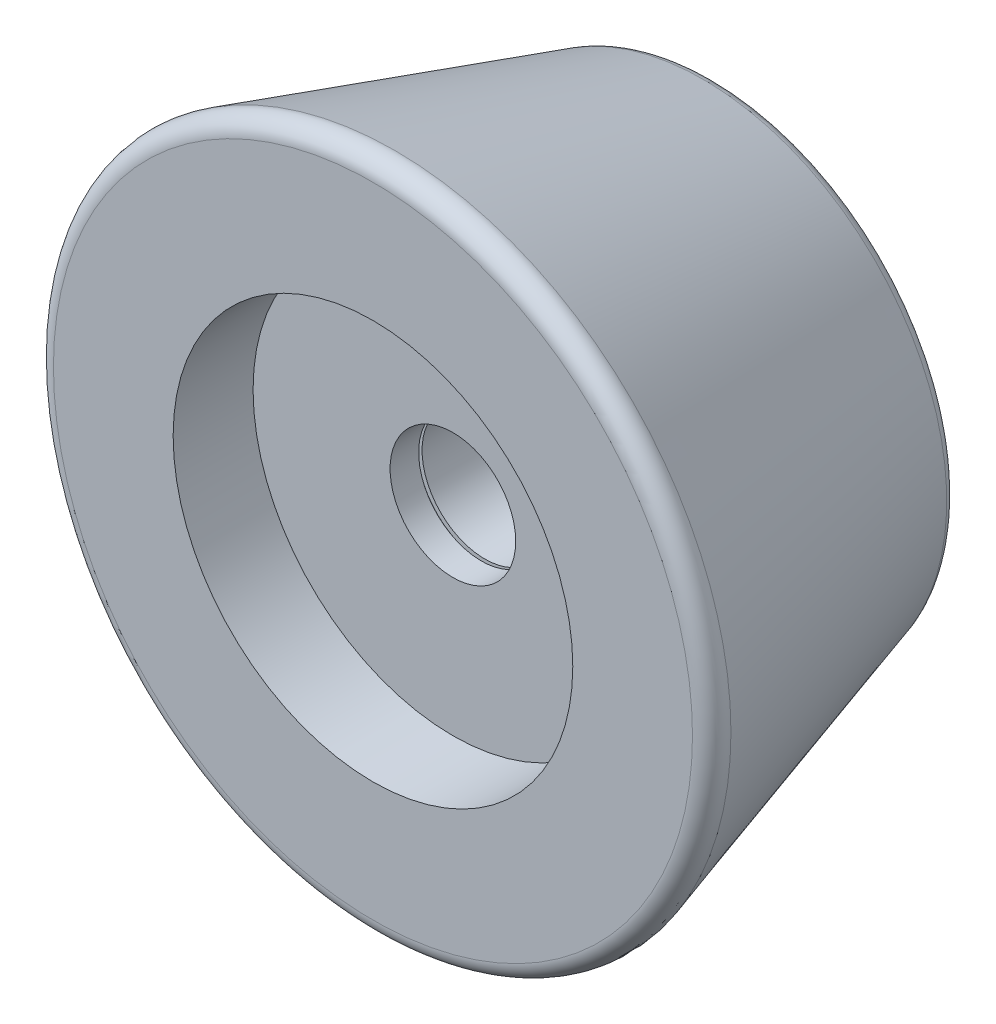
ISO-10303-21;
HEADER;
FILE_DESCRIPTION(('STEP AP214'),'2;1');
FILE_NAME('part.step','',(''),(''),'','','');
FILE_SCHEMA(('AUTOMOTIVE_DESIGN { 1 0 10303 214 1 1 1 1 }'));
ENDSEC;
DATA;
#1=APPLICATION_CONTEXT('core data for automotive mechanical design processes');
#2=APPLICATION_PROTOCOL_DEFINITION('international standard','automotive_design',2000,#1);
#3=PRODUCT_CONTEXT('',#1,'mechanical');
#4=PRODUCT('Part','Part','',(#3));
#5=PRODUCT_RELATED_PRODUCT_CATEGORY('part','',(#4));
#6=PRODUCT_DEFINITION_FORMATION('','',#4);
#7=PRODUCT_DEFINITION_CONTEXT('part definition',#1,'design');
#8=PRODUCT_DEFINITION('design','',#6,#7);
#9=PRODUCT_DEFINITION_SHAPE('','',#8);
#10=(LENGTH_UNIT() NAMED_UNIT(*) SI_UNIT(.MILLI.,.METRE.));
#11=(NAMED_UNIT(*) PLANE_ANGLE_UNIT() SI_UNIT($,.RADIAN.));
#12=(NAMED_UNIT(*) SI_UNIT($,.STERADIAN.) SOLID_ANGLE_UNIT());
#13=UNCERTAINTY_MEASURE_WITH_UNIT(LENGTH_MEASURE(1.E-05),#10,'distance_accuracy_value','');
#14=(GEOMETRIC_REPRESENTATION_CONTEXT(3) GLOBAL_UNCERTAINTY_ASSIGNED_CONTEXT((#13)) GLOBAL_UNIT_ASSIGNED_CONTEXT((#10,
#11,#12)) REPRESENTATION_CONTEXT('',''));
#15=CARTESIAN_POINT('',(0.,0.,0.));
#16=DIRECTION('',(0.,0.,1.));
#17=DIRECTION('',(1.,0.,0.));
#18=AXIS2_PLACEMENT_3D('',#15,#16,#17);
#19=CARTESIAN_POINT('',(2.75,0.,10.25));
#20=DIRECTION('',(0.,0.,-1.));
#21=DIRECTION('',(-1.,0.,0.));
#22=AXIS2_PLACEMENT_3D('',#19,#20,#21);
#23=PLANE('',#22);
#24=CARTESIAN_POINT('',(0.,0.,10.25));
#25=DIRECTION('',(0.,0.,1.));
#26=DIRECTION('',(1.,0.,0.));
#27=AXIS2_PLACEMENT_3D('',#24,#25,#26);
#28=CIRCLE('',#27,2.75);
#29=CARTESIAN_POINT('',(2.75,0.,10.25));
#30=VERTEX_POINT('',#29);
#31=EDGE_CURVE('E56',#30,#30,#28,.T.);
#32=ORIENTED_EDGE('',*,*,#31,.T.);
#33=EDGE_LOOP('',(#32));
#34=FACE_BOUND('',#33,.T.);
#35=CARTESIAN_POINT('',(0.,0.,10.25));
#36=DIRECTION('',(0.,0.,1.));
#37=DIRECTION('',(1.,0.,0.));
#38=AXIS2_PLACEMENT_3D('',#35,#36,#37);
#39=CIRCLE('',#38,2.95);
#40=CARTESIAN_POINT('',(2.95,0.,10.25));
#41=VERTEX_POINT('',#40);
#42=EDGE_CURVE('E83',#41,#41,#39,.T.);
#43=ORIENTED_EDGE('',*,*,#42,.F.);
#44=EDGE_LOOP('',(#43));
#45=FACE_BOUND('',#44,.T.);
#46=ADVANCED_FACE('F36',(#34,#45),#23,.T.);
#47=CARTESIAN_POINT('',(0.,0.,0.));
#48=DIRECTION('',(0.,0.,1.));
#49=DIRECTION('',(1.,0.,0.));
#50=AXIS2_PLACEMENT_3D('',#47,#48,#49);
#51=CYLINDRICAL_SURFACE('',#50,2.75);
#52=CARTESIAN_POINT('',(0.,0.,11.5));
#53=DIRECTION('',(0.,0.,1.));
#54=DIRECTION('',(1.,0.,0.));
#55=AXIS2_PLACEMENT_3D('',#52,#53,#54);
#56=CIRCLE('',#55,2.75);
#57=CARTESIAN_POINT('',(2.75,0.,11.5));
#58=VERTEX_POINT('',#57);
#59=EDGE_CURVE('E59',#58,#58,#56,.T.);
#60=ORIENTED_EDGE('',*,*,#59,.T.);
#61=EDGE_LOOP('',(#60));
#62=FACE_BOUND('',#61,.T.);
#63=ORIENTED_EDGE('',*,*,#31,.F.);
#64=EDGE_LOOP('',(#63));
#65=FACE_BOUND('',#64,.T.);
#66=ADVANCED_FACE('F91',(#62,#65),#51,.F.);
#67=CARTESIAN_POINT('',(2.75,0.,11.5));
#68=DIRECTION('',(0.,0.,1.));
#69=DIRECTION('',(1.,0.,0.));
#70=AXIS2_PLACEMENT_3D('',#67,#68,#69);
#71=PLANE('',#70);
#72=CARTESIAN_POINT('',(0.,0.,11.5));
#73=DIRECTION('',(0.,0.,1.));
#74=DIRECTION('',(1.,0.,0.));
#75=AXIS2_PLACEMENT_3D('',#72,#73,#74);
#76=CIRCLE('',#75,8.75);
#77=CARTESIAN_POINT('',(8.75,0.,11.5));
#78=VERTEX_POINT('',#77);
#79=EDGE_CURVE('E62',#78,#78,#76,.T.);
#80=ORIENTED_EDGE('',*,*,#79,.T.);
#81=EDGE_LOOP('',(#80));
#82=FACE_BOUND('',#81,.T.);
#83=ORIENTED_EDGE('',*,*,#59,.F.);
#84=EDGE_LOOP('',(#83));
#85=FACE_BOUND('',#84,.T.);
#86=ADVANCED_FACE('F97',(#82,#85),#71,.T.);
#87=CARTESIAN_POINT('',(0.,0.,0.));
#88=DIRECTION('',(0.,0.,1.));
#89=DIRECTION('',(1.,0.,0.));
#90=AXIS2_PLACEMENT_3D('',#87,#88,#89);
#91=CYLINDRICAL_SURFACE('',#90,8.75);
#92=CARTESIAN_POINT('',(0.,0.,15.));
#93=DIRECTION('',(0.,0.,1.));
#94=DIRECTION('',(1.,0.,0.));
#95=AXIS2_PLACEMENT_3D('',#92,#93,#94);
#96=CIRCLE('',#95,8.75);
#97=CARTESIAN_POINT('',(8.75,0.,15.));
#98=VERTEX_POINT('',#97);
#99=EDGE_CURVE('E65',#98,#98,#96,.T.);
#100=ORIENTED_EDGE('',*,*,#99,.T.);
#101=EDGE_LOOP('',(#100));
#102=FACE_BOUND('',#101,.T.);
#103=ORIENTED_EDGE('',*,*,#79,.F.);
#104=EDGE_LOOP('',(#103));
#105=FACE_BOUND('',#104,.T.);
#106=ADVANCED_FACE('F118',(#102,#105),#91,.F.);
#107=CARTESIAN_POINT('',(15.,0.,15.));
#108=DIRECTION('',(0.,0.,1.));
#109=DIRECTION('',(1.,0.,0.));
#110=AXIS2_PLACEMENT_3D('',#107,#108,#109);
#111=PLANE('',#110);
#112=CARTESIAN_POINT('',(0.,0.,15.));
#113=DIRECTION('',(0.,0.,1.));
#114=DIRECTION('',(1.,0.,0.));
#115=AXIS2_PLACEMENT_3D('',#112,#113,#114);
#116=CIRCLE('',#115,13.9919770118317);
#117=CARTESIAN_POINT('',(13.9919770118317,0.,15.));
#118=VERTEX_POINT('',#117);
#119=EDGE_CURVE('E51',#118,#118,#116,.T.);
#120=ORIENTED_EDGE('',*,*,#119,.T.);
#121=EDGE_LOOP('',(#120));
#122=FACE_BOUND('',#121,.T.);
#123=ORIENTED_EDGE('',*,*,#99,.F.);
#124=EDGE_LOOP('',(#123));
#125=FACE_BOUND('',#124,.T.);
#126=ADVANCED_FACE('F114',(#122,#125),#111,.T.);
#127=CARTESIAN_POINT('',(0.,0.,15.));
#128=DIRECTION('',(0.,0.,1.));
#129=DIRECTION('',(1.,0.,0.));
#130=AXIS2_PLACEMENT_3D('',#127,#128,#129);
#131=CONICAL_SURFACE('',#130,15.,0.291456794477867);
#132=CARTESIAN_POINT('',(0.,0.,14.0344890858252));
#133=DIRECTION('',(0.,0.,-1.));
#134=DIRECTION('',(-1.,0.,0.));
#135=AXIS2_PLACEMENT_3D('',#132,#133,#134);
#136=CIRCLE('',#135,14.7103467257476);
#137=CARTESIAN_POINT('',(-14.7103467257476,0.,14.0344890858252));
#138=VERTEX_POINT('',#137);
#139=EDGE_CURVE('E43',#138,#138,#136,.T.);
#140=ORIENTED_EDGE('',*,*,#139,.T.);
#141=EDGE_LOOP('',(#140));
#142=FACE_BOUND('',#141,.T.);
#143=CARTESIAN_POINT('',(0.,0.,0.534489085825249));
#144=DIRECTION('',(0.,0.,-1.));
#145=DIRECTION('',(-1.,0.,0.));
#146=AXIS2_PLACEMENT_3D('',#143,#144,#145);
#147=CIRCLE('',#146,10.6603467257476);
#148=CARTESIAN_POINT('',(-10.6603467257476,0.,0.534489085825249));
#149=VERTEX_POINT('',#148);
#150=EDGE_CURVE('E47',#149,#149,#147,.F.);
#151=ORIENTED_EDGE('',*,*,#150,.T.);
#152=EDGE_LOOP('',(#151));
#153=FACE_BOUND('',#152,.T.);
#154=ADVANCED_FACE('F117',(#142,#153),#131,.T.);
#155=CARTESIAN_POINT('',(5.125,0.,0.));
#156=DIRECTION('',(0.,0.,-1.));
#157=DIRECTION('',(-1.,0.,0.));
#158=AXIS2_PLACEMENT_3D('',#155,#156,#157);
#159=PLANE('',#158);
#160=CARTESIAN_POINT('',(0.,0.,0.));
#161=DIRECTION('',(0.,0.,-1.));
#162=DIRECTION('',(-1.,0.,0.));
#163=AXIS2_PLACEMENT_3D('',#160,#161,#162);
#164=CIRCLE('',#163,9.94197701183171);
#165=CARTESIAN_POINT('',(-9.94197701183171,0.,0.));
#166=VERTEX_POINT('',#165);
#167=EDGE_CURVE('E10',#166,#166,#164,.T.);
#168=ORIENTED_EDGE('',*,*,#167,.T.);
#169=EDGE_LOOP('',(#168));
#170=FACE_BOUND('',#169,.T.);
#171=CARTESIAN_POINT('',(0.,0.,0.));
#172=DIRECTION('',(0.,0.,1.));
#173=DIRECTION('',(1.,0.,0.));
#174=AXIS2_PLACEMENT_3D('',#171,#172,#173);
#175=CIRCLE('',#174,5.125);
#176=CARTESIAN_POINT('',(5.125,0.,0.));
#177=VERTEX_POINT('',#176);
#178=EDGE_CURVE('E68',#177,#177,#175,.T.);
#179=ORIENTED_EDGE('',*,*,#178,.T.);
#180=EDGE_LOOP('',(#179));
#181=FACE_BOUND('',#180,.T.);
#182=ADVANCED_FACE('F137',(#170,#181),#159,.T.);
#183=CARTESIAN_POINT('',(0.,0.,0.));
#184=DIRECTION('',(0.,0.,1.));
#185=DIRECTION('',(1.,0.,0.));
#186=AXIS2_PLACEMENT_3D('',#183,#184,#185);
#187=CYLINDRICAL_SURFACE('',#186,5.125);
#188=CARTESIAN_POINT('',(0.,0.,3.25));
#189=DIRECTION('',(0.,0.,1.));
#190=DIRECTION('',(1.,0.,0.));
#191=AXIS2_PLACEMENT_3D('',#188,#189,#190);
#192=CIRCLE('',#191,5.125);
#193=CARTESIAN_POINT('',(5.125,0.,3.25));
#194=VERTEX_POINT('',#193);
#195=EDGE_CURVE('E71',#194,#194,#192,.T.);
#196=ORIENTED_EDGE('',*,*,#195,.T.);
#197=EDGE_LOOP('',(#196));
#198=FACE_BOUND('',#197,.T.);
#199=ORIENTED_EDGE('',*,*,#178,.F.);
#200=EDGE_LOOP('',(#199));
#201=FACE_BOUND('',#200,.T.);
#202=ADVANCED_FACE('F140',(#198,#201),#187,.F.);
#203=CARTESIAN_POINT('',(2.75,0.,3.25));
#204=DIRECTION('',(0.,0.,-1.));
#205=DIRECTION('',(-1.,0.,0.));
#206=AXIS2_PLACEMENT_3D('',#203,#204,#205);
#207=PLANE('',#206);
#208=CARTESIAN_POINT('',(0.,0.,3.25));
#209=DIRECTION('',(0.,0.,1.));
#210=DIRECTION('',(1.,0.,0.));
#211=AXIS2_PLACEMENT_3D('',#208,#209,#210);
#212=CIRCLE('',#211,2.75);
#213=CARTESIAN_POINT('',(2.75,0.,3.25));
#214=VERTEX_POINT('',#213);
#215=EDGE_CURVE('E74',#214,#214,#212,.T.);
#216=ORIENTED_EDGE('',*,*,#215,.T.);
#217=EDGE_LOOP('',(#216));
#218=FACE_BOUND('',#217,.T.);
#219=ORIENTED_EDGE('',*,*,#195,.F.);
#220=EDGE_LOOP('',(#219));
#221=FACE_BOUND('',#220,.T.);
#222=ADVANCED_FACE('F143',(#218,#221),#207,.T.);
#223=CARTESIAN_POINT('',(0.,0.,0.));
#224=DIRECTION('',(0.,0.,1.));
#225=DIRECTION('',(1.,0.,0.));
#226=AXIS2_PLACEMENT_3D('',#223,#224,#225);
#227=CYLINDRICAL_SURFACE('',#226,2.75);
#228=CARTESIAN_POINT('',(0.,0.,10.1));
#229=DIRECTION('',(0.,0.,1.));
#230=DIRECTION('',(1.,0.,0.));
#231=AXIS2_PLACEMENT_3D('',#228,#229,#230);
#232=CIRCLE('',#231,2.75);
#233=CARTESIAN_POINT('',(2.75,0.,10.1));
#234=VERTEX_POINT('',#233);
#235=EDGE_CURVE('E77',#234,#234,#232,.T.);
#236=ORIENTED_EDGE('',*,*,#235,.T.);
#237=EDGE_LOOP('',(#236));
#238=FACE_BOUND('',#237,.T.);
#239=ORIENTED_EDGE('',*,*,#215,.F.);
#240=EDGE_LOOP('',(#239));
#241=FACE_BOUND('',#240,.T.);
#242=ADVANCED_FACE('F147',(#238,#241),#227,.F.);
#243=CARTESIAN_POINT('',(2.75,0.,10.1));
#244=DIRECTION('',(0.,0.,1.));
#245=DIRECTION('',(1.,0.,0.));
#246=AXIS2_PLACEMENT_3D('',#243,#244,#245);
#247=PLANE('',#246);
#248=CARTESIAN_POINT('',(0.,0.,10.1));
#249=DIRECTION('',(0.,0.,1.));
#250=DIRECTION('',(1.,0.,0.));
#251=AXIS2_PLACEMENT_3D('',#248,#249,#250);
#252=CIRCLE('',#251,2.95);
#253=CARTESIAN_POINT('',(2.95,0.,10.1));
#254=VERTEX_POINT('',#253);
#255=EDGE_CURVE('E80',#254,#254,#252,.T.);
#256=ORIENTED_EDGE('',*,*,#255,.T.);
#257=EDGE_LOOP('',(#256));
#258=FACE_BOUND('',#257,.T.);
#259=ORIENTED_EDGE('',*,*,#235,.F.);
#260=EDGE_LOOP('',(#259));
#261=FACE_BOUND('',#260,.T.);
#262=ADVANCED_FACE('F109',(#258,#261),#247,.T.);
#263=CARTESIAN_POINT('',(0.,0.,0.));
#264=DIRECTION('',(0.,0.,1.));
#265=DIRECTION('',(1.,0.,0.));
#266=AXIS2_PLACEMENT_3D('',#263,#264,#265);
#267=CYLINDRICAL_SURFACE('',#266,2.95);
#268=ORIENTED_EDGE('',*,*,#42,.T.);
#269=EDGE_LOOP('',(#268));
#270=FACE_BOUND('',#269,.T.);
#271=ORIENTED_EDGE('',*,*,#255,.F.);
#272=EDGE_LOOP('',(#271));
#273=FACE_BOUND('',#272,.T.);
#274=ADVANCED_FACE('F87',(#270,#273),#267,.F.);
#275=CARTESIAN_POINT('',(0.,0.,14.25));
#276=DIRECTION('',(0.,0.,1.));
#277=DIRECTION('',(1.,0.,0.));
#278=AXIS2_PLACEMENT_3D('',#275,#276,#277);
#279=TOROIDAL_SURFACE('',#278,13.9919770118317,0.75);
#280=ORIENTED_EDGE('',*,*,#139,.F.);
#281=EDGE_LOOP('',(#280));
#282=FACE_BOUND('',#281,.T.);
#283=ORIENTED_EDGE('',*,*,#119,.F.);
#284=EDGE_LOOP('',(#283));
#285=FACE_BOUND('',#284,.T.);
#286=ADVANCED_FACE('F101',(#282,#285),#279,.T.);
#287=CARTESIAN_POINT('',(0.,0.,0.750000000000001));
#288=DIRECTION('',(0.,0.,-1.));
#289=DIRECTION('',(-1.,0.,0.));
#290=AXIS2_PLACEMENT_3D('',#287,#288,#289);
#291=TOROIDAL_SURFACE('',#290,9.94197701183171,0.75);
#292=ORIENTED_EDGE('',*,*,#167,.F.);
#293=EDGE_LOOP('',(#292));
#294=FACE_BOUND('',#293,.T.);
#295=ORIENTED_EDGE('',*,*,#150,.F.);
#296=EDGE_LOOP('',(#295));
#297=FACE_BOUND('',#296,.T.);
#298=ADVANCED_FACE('F38',(#294,#297),#291,.T.);
#299=CLOSED_SHELL('',(#46,#66,#86,#106,#126,#154,#182,#202,#222,#242,#262,#274,#286,#298));
#300=MANIFOLD_SOLID_BREP('B2',#299);
#301=ADVANCED_BREP_SHAPE_REPRESENTATION('',(#18,#300),#14);
#302=SHAPE_DEFINITION_REPRESENTATION(#9,#301);
ENDSEC;
END-ISO-10303-21;
